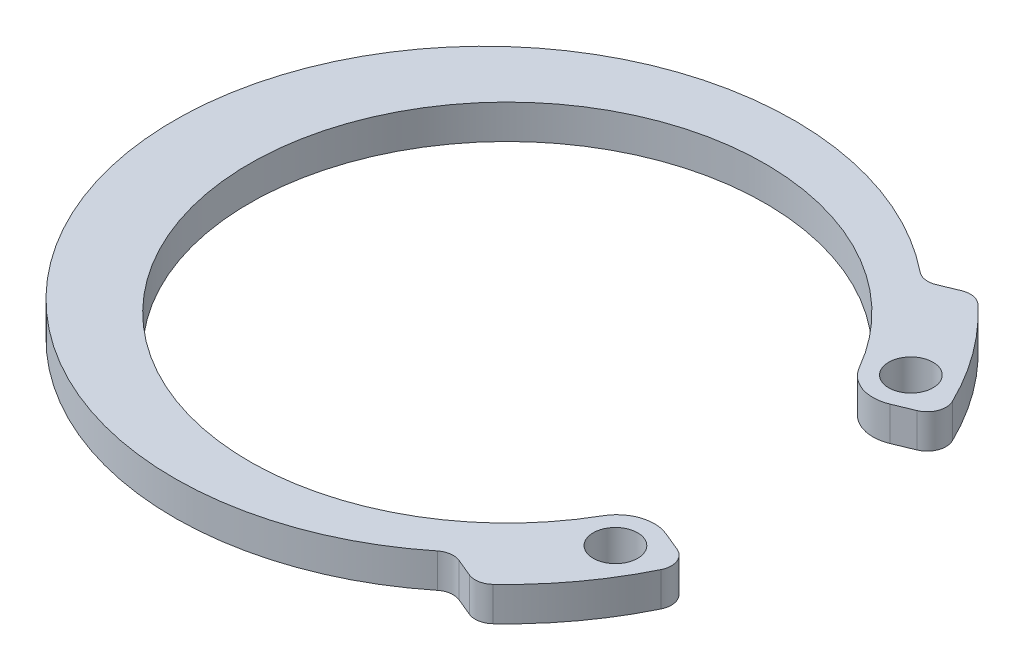
ISO-10303-21;
HEADER;
FILE_DESCRIPTION(('STEP AP214'),'2;1');
FILE_NAME('part.step','',(''),(''),'','','');
FILE_SCHEMA(('AUTOMOTIVE_DESIGN { 1 0 10303 214 1 1 1 1 }'));
ENDSEC;
DATA;
#1=APPLICATION_CONTEXT('core data for automotive mechanical design processes');
#2=APPLICATION_PROTOCOL_DEFINITION('international standard','automotive_design',2000,#1);
#3=PRODUCT_CONTEXT('',#1,'mechanical');
#4=PRODUCT('Part','Part','',(#3));
#5=PRODUCT_RELATED_PRODUCT_CATEGORY('part','',(#4));
#6=PRODUCT_DEFINITION_FORMATION('','',#4);
#7=PRODUCT_DEFINITION_CONTEXT('part definition',#1,'design');
#8=PRODUCT_DEFINITION('design','',#6,#7);
#9=PRODUCT_DEFINITION_SHAPE('','',#8);
#10=(LENGTH_UNIT() NAMED_UNIT(*) SI_UNIT(.MILLI.,.METRE.));
#11=(NAMED_UNIT(*) PLANE_ANGLE_UNIT() SI_UNIT($,.RADIAN.));
#12=(NAMED_UNIT(*) SI_UNIT($,.STERADIAN.) SOLID_ANGLE_UNIT());
#13=UNCERTAINTY_MEASURE_WITH_UNIT(LENGTH_MEASURE(1.E-05),#10,'distance_accuracy_value','');
#14=(GEOMETRIC_REPRESENTATION_CONTEXT(3) GLOBAL_UNCERTAINTY_ASSIGNED_CONTEXT((#13)) GLOBAL_UNIT_ASSIGNED_CONTEXT((#10,
#11,#12)) REPRESENTATION_CONTEXT('',''));
#15=CARTESIAN_POINT('',(0.,0.,0.));
#16=DIRECTION('',(0.,0.,1.));
#17=DIRECTION('',(1.,0.,0.));
#18=AXIS2_PLACEMENT_3D('',#15,#16,#17);
#19=CARTESIAN_POINT('',(6.30656928506754,0.5,6.69829708602438));
#20=DIRECTION('',(0.,1.,0.));
#21=DIRECTION('',(0.,0.,1.));
#22=AXIS2_PLACEMENT_3D('',#19,#20,#21);
#23=PLANE('',#22);
#24=CARTESIAN_POINT('',(7.49111974273539,0.5,4.32500000000001));
#25=DIRECTION('',(0.,1.,0.));
#26=DIRECTION('',(0.,0.,1.));
#27=AXIS2_PLACEMENT_3D('',#24,#25,#26);
#28=CIRCLE('',#27,0.649999999999999);
#29=CARTESIAN_POINT('',(7.49111974273539,0.5,4.97500000000001));
#30=VERTEX_POINT('',#29);
#31=EDGE_CURVE('E213',#30,#30,#28,.T.);
#32=ORIENTED_EDGE('',*,*,#31,.F.);
#33=EDGE_LOOP('',(#32));
#34=FACE_BOUND('',#33,.T.);
#35=CARTESIAN_POINT('',(6.30656928506754,0.5,6.69829708602438));
#36=DIRECTION('',(0.,1.,0.));
#37=DIRECTION('',(0.,0.,1.));
#38=AXIS2_PLACEMENT_3D('',#35,#36,#37);
#39=CIRCLE('',#38,0.550000000000001);
#40=CARTESIAN_POINT('',(6.09609339726674,0.5,7.20643082890558));
#41=VERTEX_POINT('',#40);
#42=CARTESIAN_POINT('',(6.68359244884876,0.5,7.0987387596454));
#43=VERTEX_POINT('',#42);
#44=EDGE_CURVE('E216',#41,#43,#39,.T.);
#45=ORIENTED_EDGE('',*,*,#44,.T.);
#46=CARTESIAN_POINT('',(0.,0.5,0.));
#47=DIRECTION('',(0.,1.,0.));
#48=DIRECTION('',(0.,0.,1.));
#49=AXIS2_PLACEMENT_3D('',#46,#47,#48);
#50=CIRCLE('',#49,9.75);
#51=CARTESIAN_POINT('',(8.76865554317916,0.5,4.26300128607457));
#52=VERTEX_POINT('',#51);
#53=EDGE_CURVE('E148',#43,#52,#50,.T.);
#54=ORIENTED_EDGE('',*,*,#53,.T.);
#55=CARTESIAN_POINT('',(8.2740134356152,0.5,4.02252429044985));
#56=DIRECTION('',(0.,1.,0.));
#57=DIRECTION('',(0.,0.,-1.));
#58=AXIS2_PLACEMENT_3D('',#55,#56,#57);
#59=CIRCLE('',#58,0.550000000000001);
#60=CARTESIAN_POINT('',(8.484489323416,0.5,3.51439054756864));
#61=VERTEX_POINT('',#60);
#62=EDGE_CURVE('E219',#52,#61,#59,.T.);
#63=ORIENTED_EDGE('',*,*,#62,.T.);
#64=DIRECTION('',(-0.923879532511286,0.,-0.382683432365091));
#65=VECTOR('',#64,1.);
#66=CARTESIAN_POINT('',(7.92667641354479,0.5,3.28333687503318));
#67=LINE('',#66,#65);
#68=CARTESIAN_POINT('',(7.92667641354479,0.5,3.28333687503318));
#69=VERTEX_POINT('',#68);
#70=EDGE_CURVE('E221',#61,#69,#67,.T.);
#71=ORIENTED_EDGE('',*,*,#70,.T.);
#72=CARTESIAN_POINT('',(7.50572463794319,0.5,4.2996043607956));
#73=DIRECTION('',(0.,1.,0.));
#74=DIRECTION('',(0.,0.,1.));
#75=AXIS2_PLACEMENT_3D('',#72,#73,#74);
#76=CIRCLE('',#75,1.1);
#77=CARTESIAN_POINT('',(6.55123942386949,0.5,3.75283386404703));
#78=VERTEX_POINT('',#77);
#79=EDGE_CURVE('E223',#69,#78,#76,.T.);
#80=ORIENTED_EDGE('',*,*,#79,.T.);
#81=CARTESIAN_POINT('',(0.,0.5,0.));
#82=DIRECTION('',(0.,-1.,0.));
#83=DIRECTION('',(0.,0.,1.));
#84=AXIS2_PLACEMENT_3D('',#81,#82,#83);
#85=CIRCLE('',#84,7.55);
#86=CARTESIAN_POINT('',(6.55123942386949,0.5,-3.75283386404703));
#87=VERTEX_POINT('',#86);
#88=EDGE_CURVE('E225',#78,#87,#85,.T.);
#89=ORIENTED_EDGE('',*,*,#88,.T.);
#90=CARTESIAN_POINT('',(7.50572463794319,0.5,-4.2996043607956));
#91=DIRECTION('',(0.,1.,0.));
#92=DIRECTION('',(0.,0.,-1.));
#93=AXIS2_PLACEMENT_3D('',#90,#91,#92);
#94=CIRCLE('',#93,1.1);
#95=CARTESIAN_POINT('',(7.92667641354479,0.5,-3.28333687503318));
#96=VERTEX_POINT('',#95);
#97=EDGE_CURVE('E227',#87,#96,#94,.T.);
#98=ORIENTED_EDGE('',*,*,#97,.T.);
#99=DIRECTION('',(0.923879532511287,0.,-0.38268343236509));
#100=VECTOR('',#99,1.);
#101=CARTESIAN_POINT('',(7.92667641354479,0.5,-3.28333687503318));
#102=LINE('',#101,#100);
#103=CARTESIAN_POINT('',(8.484489323416,0.5,-3.51439054756864));
#104=VERTEX_POINT('',#103);
#105=EDGE_CURVE('E229',#96,#104,#102,.T.);
#106=ORIENTED_EDGE('',*,*,#105,.T.);
#107=CARTESIAN_POINT('',(8.2740134356152,0.5,-4.02252429044985));
#108=DIRECTION('',(0.,1.,0.));
#109=DIRECTION('',(0.,0.,1.));
#110=AXIS2_PLACEMENT_3D('',#107,#108,#109);
#111=CIRCLE('',#110,0.550000000000001);
#112=CARTESIAN_POINT('',(8.76865554317916,0.5,-4.26300128607457));
#113=VERTEX_POINT('',#112);
#114=EDGE_CURVE('E231',#104,#113,#111,.T.);
#115=ORIENTED_EDGE('',*,*,#114,.T.);
#116=CARTESIAN_POINT('',(0.,0.5,0.));
#117=DIRECTION('',(0.,1.,0.));
#118=DIRECTION('',(0.,0.,-1.));
#119=AXIS2_PLACEMENT_3D('',#116,#117,#118);
#120=CIRCLE('',#119,9.75);
#121=CARTESIAN_POINT('',(6.68359244884875,0.5,-7.0987387596454));
#122=VERTEX_POINT('',#121);
#123=EDGE_CURVE('E233',#113,#122,#120,.T.);
#124=ORIENTED_EDGE('',*,*,#123,.T.);
#125=CARTESIAN_POINT('',(6.30656928506754,0.5,-6.69829708602438));
#126=DIRECTION('',(0.,1.,0.));
#127=DIRECTION('',(0.,0.,-1.));
#128=AXIS2_PLACEMENT_3D('',#125,#126,#127);
#129=CIRCLE('',#128,0.549999999999998);
#130=CARTESIAN_POINT('',(6.09609339726674,0.5,-7.20643082890559));
#131=VERTEX_POINT('',#130);
#132=EDGE_CURVE('E235',#122,#131,#129,.T.);
#133=ORIENTED_EDGE('',*,*,#132,.T.);
#134=DIRECTION('',(-0.923879532511286,0.,0.382683432365091));
#135=VECTOR('',#134,1.);
#136=CARTESIAN_POINT('',(5.57317503566976,0.5,-6.9898309515182));
#137=LINE('',#136,#135);
#138=CARTESIAN_POINT('',(5.57317503566976,0.5,-6.98983095151819));
#139=VERTEX_POINT('',#138);
#140=EDGE_CURVE('E237',#131,#139,#137,.T.);
#141=ORIENTED_EDGE('',*,*,#140,.T.);
#142=CARTESIAN_POINT('',(5.36269914786896,0.5,-7.4979646943994));
#143=DIRECTION('',(0.,-1.,0.));
#144=DIRECTION('',(0.,0.,1.));
#145=AXIS2_PLACEMENT_3D('',#142,#143,#144);
#146=CIRCLE('',#145,0.550000000000001);
#147=CARTESIAN_POINT('',(5.01778470905518,0.5,-7.06955597612003));
#148=VERTEX_POINT('',#147);
#149=EDGE_CURVE('E239',#139,#148,#146,.T.);
#150=ORIENTED_EDGE('',*,*,#149,.T.);
#151=CARTESIAN_POINT('',(-0.673957377705812,0.5,0.));
#152=DIRECTION('',(0.,1.,0.));
#153=DIRECTION('',(0.,0.,1.));
#154=AXIS2_PLACEMENT_3D('',#151,#152,#153);
#155=CIRCLE('',#154,9.07604262229419);
#156=CARTESIAN_POINT('',(5.01778470905518,0.5,7.06955597612003));
#157=VERTEX_POINT('',#156);
#158=EDGE_CURVE('E241',#148,#157,#155,.T.);
#159=ORIENTED_EDGE('',*,*,#158,.T.);
#160=CARTESIAN_POINT('',(5.36269914786896,0.5,7.4979646943994));
#161=DIRECTION('',(0.,-1.,0.));
#162=DIRECTION('',(0.,0.,-1.));
#163=AXIS2_PLACEMENT_3D('',#160,#161,#162);
#164=CIRCLE('',#163,0.55);
#165=CARTESIAN_POINT('',(5.57317503566976,0.5,6.98983095151819));
#166=VERTEX_POINT('',#165);
#167=EDGE_CURVE('E52',#157,#166,#164,.T.);
#168=ORIENTED_EDGE('',*,*,#167,.T.);
#169=DIRECTION('',(0.923879532511286,0.,0.382683432365091));
#170=VECTOR('',#169,1.);
#171=CARTESIAN_POINT('',(5.57317503566976,0.5,6.98983095151819));
#172=LINE('',#171,#170);
#173=EDGE_CURVE('E47',#166,#41,#172,.T.);
#174=ORIENTED_EDGE('',*,*,#173,.T.);
#175=EDGE_LOOP('',(#45,#54,#63,#71,#80,#89,#98,#106,#115,#124,#133,#141,#150,#159,#168,#174));
#176=FACE_BOUND('',#175,.T.);
#177=CARTESIAN_POINT('',(7.49111974273539,0.5,-4.32500000000001));
#178=DIRECTION('',(0.,1.,0.));
#179=DIRECTION('',(0.,0.,1.));
#180=AXIS2_PLACEMENT_3D('',#177,#178,#179);
#181=CIRCLE('',#180,0.649999999999999);
#182=CARTESIAN_POINT('',(7.49111974273539,0.5,-3.67500000000001));
#183=VERTEX_POINT('',#182);
#184=EDGE_CURVE('E210',#183,#183,#181,.T.);
#185=ORIENTED_EDGE('',*,*,#184,.F.);
#186=EDGE_LOOP('',(#185));
#187=FACE_BOUND('',#186,.T.);
#188=ADVANCED_FACE('F32',(#34,#176,#187),#23,.T.);
#189=CARTESIAN_POINT('',(6.30656928506754,0.5,6.69829708602438));
#190=DIRECTION('',(0.,-1.,0.));
#191=DIRECTION('',(0.,0.,-1.));
#192=AXIS2_PLACEMENT_3D('',#189,#190,#191);
#193=CYLINDRICAL_SURFACE('',#192,0.550000000000001);
#194=DIRECTION('',(0.,-1.,0.));
#195=VECTOR('',#194,1.);
#196=CARTESIAN_POINT('',(6.09609339726674,0.5,7.20643082890558));
#197=LINE('',#196,#195);
#198=CARTESIAN_POINT('',(6.09609339726674,-0.5,7.20643082890558));
#199=VERTEX_POINT('',#198);
#200=EDGE_CURVE('E163',#41,#199,#197,.T.);
#201=ORIENTED_EDGE('',*,*,#200,.T.);
#202=CARTESIAN_POINT('',(6.30656928506754,-0.5,6.69829708602438));
#203=DIRECTION('',(0.,1.,0.));
#204=DIRECTION('',(0.,0.,1.));
#205=AXIS2_PLACEMENT_3D('',#202,#203,#204);
#206=CIRCLE('',#205,0.550000000000001);
#207=CARTESIAN_POINT('',(6.68359244884876,-0.5,7.0987387596454));
#208=VERTEX_POINT('',#207);
#209=EDGE_CURVE('E157',#199,#208,#206,.T.);
#210=ORIENTED_EDGE('',*,*,#209,.T.);
#211=DIRECTION('',(0.,-1.,0.));
#212=VECTOR('',#211,1.);
#213=CARTESIAN_POINT('',(6.68359244884876,0.5,7.0987387596454));
#214=LINE('',#213,#212);
#215=EDGE_CURVE('E11',#43,#208,#214,.T.);
#216=ORIENTED_EDGE('',*,*,#215,.F.);
#217=ORIENTED_EDGE('',*,*,#44,.F.);
#218=EDGE_LOOP('',(#201,#210,#216,#217));
#219=FACE_BOUND('',#218,.T.);
#220=ADVANCED_FACE('F34',(#219),#193,.T.);
#221=CARTESIAN_POINT('',(0.,0.5,0.));
#222=DIRECTION('',(0.,-1.,0.));
#223=DIRECTION('',(0.,0.,-1.));
#224=AXIS2_PLACEMENT_3D('',#221,#222,#223);
#225=CYLINDRICAL_SURFACE('',#224,9.75);
#226=ORIENTED_EDGE('',*,*,#215,.T.);
#227=CARTESIAN_POINT('',(0.,-0.5,0.));
#228=DIRECTION('',(0.,1.,0.));
#229=DIRECTION('',(0.,0.,1.));
#230=AXIS2_PLACEMENT_3D('',#227,#228,#229);
#231=CIRCLE('',#230,9.75);
#232=CARTESIAN_POINT('',(8.76865554317916,-0.5,4.26300128607457));
#233=VERTEX_POINT('',#232);
#234=EDGE_CURVE('E147',#208,#233,#231,.T.);
#235=ORIENTED_EDGE('',*,*,#234,.T.);
#236=DIRECTION('',(0.,-1.,0.));
#237=VECTOR('',#236,1.);
#238=CARTESIAN_POINT('',(8.76865554317916,0.5,4.26300128607457));
#239=LINE('',#238,#237);
#240=EDGE_CURVE('E40',#52,#233,#239,.T.);
#241=ORIENTED_EDGE('',*,*,#240,.F.);
#242=ORIENTED_EDGE('',*,*,#53,.F.);
#243=EDGE_LOOP('',(#226,#235,#241,#242));
#244=FACE_BOUND('',#243,.T.);
#245=ADVANCED_FACE('F145',(#244),#225,.T.);
#246=CARTESIAN_POINT('',(8.2740134356152,0.5,4.02252429044985));
#247=DIRECTION('',(0.,-1.,0.));
#248=DIRECTION('',(0.,0.,-1.));
#249=AXIS2_PLACEMENT_3D('',#246,#247,#248);
#250=CYLINDRICAL_SURFACE('',#249,0.550000000000001);
#251=ORIENTED_EDGE('',*,*,#240,.T.);
#252=CARTESIAN_POINT('',(8.2740134356152,-0.5,4.02252429044985));
#253=DIRECTION('',(0.,1.,0.));
#254=DIRECTION('',(0.,0.,-1.));
#255=AXIS2_PLACEMENT_3D('',#252,#253,#254);
#256=CIRCLE('',#255,0.550000000000001);
#257=CARTESIAN_POINT('',(8.484489323416,-0.5,3.51439054756864));
#258=VERTEX_POINT('',#257);
#259=EDGE_CURVE('E161',#233,#258,#256,.T.);
#260=ORIENTED_EDGE('',*,*,#259,.T.);
#261=DIRECTION('',(0.,-1.,0.));
#262=VECTOR('',#261,1.);
#263=CARTESIAN_POINT('',(8.484489323416,0.5,3.51439054756864));
#264=LINE('',#263,#262);
#265=EDGE_CURVE('E270',#61,#258,#264,.T.);
#266=ORIENTED_EDGE('',*,*,#265,.F.);
#267=ORIENTED_EDGE('',*,*,#62,.F.);
#268=EDGE_LOOP('',(#251,#260,#266,#267));
#269=FACE_BOUND('',#268,.T.);
#270=ADVANCED_FACE('F273',(#269),#250,.T.);
#271=CARTESIAN_POINT('',(7.92667641354479,0.5,3.28333687503318));
#272=DIRECTION('',(-0.382683432365091,0.,0.923879532511286));
#273=DIRECTION('',(0.923879532511286,0.,0.382683432365091));
#274=AXIS2_PLACEMENT_3D('',#271,#272,#273);
#275=PLANE('',#274);
#276=ORIENTED_EDGE('',*,*,#265,.T.);
#277=DIRECTION('',(-0.923879532511286,0.,-0.382683432365091));
#278=VECTOR('',#277,1.);
#279=CARTESIAN_POINT('',(7.92667641354479,-0.5,3.28333687503318));
#280=LINE('',#279,#278);
#281=CARTESIAN_POINT('',(7.92667641354479,-0.5,3.28333687503318));
#282=VERTEX_POINT('',#281);
#283=EDGE_CURVE('E172',#258,#282,#280,.T.);
#284=ORIENTED_EDGE('',*,*,#283,.T.);
#285=DIRECTION('',(0.,-1.,0.));
#286=VECTOR('',#285,1.);
#287=CARTESIAN_POINT('',(7.92667641354479,0.5,3.28333687503318));
#288=LINE('',#287,#286);
#289=EDGE_CURVE('E268',#69,#282,#288,.T.);
#290=ORIENTED_EDGE('',*,*,#289,.F.);
#291=ORIENTED_EDGE('',*,*,#70,.F.);
#292=EDGE_LOOP('',(#276,#284,#290,#291));
#293=FACE_BOUND('',#292,.T.);
#294=ADVANCED_FACE('F281',(#293),#275,.F.);
#295=CARTESIAN_POINT('',(7.50572463794319,0.5,4.2996043607956));
#296=DIRECTION('',(0.,-1.,0.));
#297=DIRECTION('',(0.,0.,-1.));
#298=AXIS2_PLACEMENT_3D('',#295,#296,#297);
#299=CYLINDRICAL_SURFACE('',#298,1.1);
#300=ORIENTED_EDGE('',*,*,#289,.T.);
#301=CARTESIAN_POINT('',(7.50572463794319,-0.5,4.2996043607956));
#302=DIRECTION('',(0.,1.,0.));
#303=DIRECTION('',(0.,0.,1.));
#304=AXIS2_PLACEMENT_3D('',#301,#302,#303);
#305=CIRCLE('',#304,1.1);
#306=CARTESIAN_POINT('',(6.55123942386949,-0.5,3.75283386404703));
#307=VERTEX_POINT('',#306);
#308=EDGE_CURVE('E175',#282,#307,#305,.T.);
#309=ORIENTED_EDGE('',*,*,#308,.T.);
#310=DIRECTION('',(0.,-1.,0.));
#311=VECTOR('',#310,1.);
#312=CARTESIAN_POINT('',(6.55123942386949,0.5,3.75283386404703));
#313=LINE('',#312,#311);
#314=EDGE_CURVE('E266',#78,#307,#313,.T.);
#315=ORIENTED_EDGE('',*,*,#314,.F.);
#316=ORIENTED_EDGE('',*,*,#79,.F.);
#317=EDGE_LOOP('',(#300,#309,#315,#316));
#318=FACE_BOUND('',#317,.T.);
#319=ADVANCED_FACE('F284',(#318),#299,.T.);
#320=CARTESIAN_POINT('',(0.,0.5,0.));
#321=DIRECTION('',(0.,-1.,0.));
#322=DIRECTION('',(0.,0.,-1.));
#323=AXIS2_PLACEMENT_3D('',#320,#321,#322);
#324=CYLINDRICAL_SURFACE('',#323,7.55);
#325=ORIENTED_EDGE('',*,*,#314,.T.);
#326=CARTESIAN_POINT('',(0.,-0.5,0.));
#327=DIRECTION('',(0.,-1.,0.));
#328=DIRECTION('',(0.,0.,1.));
#329=AXIS2_PLACEMENT_3D('',#326,#327,#328);
#330=CIRCLE('',#329,7.55);
#331=CARTESIAN_POINT('',(6.55123942386949,-0.5,-3.75283386404703));
#332=VERTEX_POINT('',#331);
#333=EDGE_CURVE('E178',#307,#332,#330,.T.);
#334=ORIENTED_EDGE('',*,*,#333,.T.);
#335=DIRECTION('',(0.,-1.,0.));
#336=VECTOR('',#335,1.);
#337=CARTESIAN_POINT('',(6.55123942386949,0.5,-3.75283386404703));
#338=LINE('',#337,#336);
#339=EDGE_CURVE('E264',#87,#332,#338,.T.);
#340=ORIENTED_EDGE('',*,*,#339,.F.);
#341=ORIENTED_EDGE('',*,*,#88,.F.);
#342=EDGE_LOOP('',(#325,#334,#340,#341));
#343=FACE_BOUND('',#342,.T.);
#344=ADVANCED_FACE('F289',(#343),#324,.F.);
#345=CARTESIAN_POINT('',(7.50572463794319,0.5,-4.2996043607956));
#346=DIRECTION('',(0.,-1.,0.));
#347=DIRECTION('',(0.,0.,-1.));
#348=AXIS2_PLACEMENT_3D('',#345,#346,#347);
#349=CYLINDRICAL_SURFACE('',#348,1.1);
#350=ORIENTED_EDGE('',*,*,#339,.T.);
#351=CARTESIAN_POINT('',(7.50572463794319,-0.5,-4.2996043607956));
#352=DIRECTION('',(0.,1.,0.));
#353=DIRECTION('',(0.,0.,-1.));
#354=AXIS2_PLACEMENT_3D('',#351,#352,#353);
#355=CIRCLE('',#354,1.1);
#356=CARTESIAN_POINT('',(7.92667641354479,-0.5,-3.28333687503318));
#357=VERTEX_POINT('',#356);
#358=EDGE_CURVE('E181',#332,#357,#355,.T.);
#359=ORIENTED_EDGE('',*,*,#358,.T.);
#360=DIRECTION('',(0.,-1.,0.));
#361=VECTOR('',#360,1.);
#362=CARTESIAN_POINT('',(7.92667641354479,0.5,-3.28333687503318));
#363=LINE('',#362,#361);
#364=EDGE_CURVE('E262',#96,#357,#363,.T.);
#365=ORIENTED_EDGE('',*,*,#364,.F.);
#366=ORIENTED_EDGE('',*,*,#97,.F.);
#367=EDGE_LOOP('',(#350,#359,#365,#366));
#368=FACE_BOUND('',#367,.T.);
#369=ADVANCED_FACE('F295',(#368),#349,.T.);
#370=CARTESIAN_POINT('',(7.92667641354479,0.5,-3.28333687503318));
#371=DIRECTION('',(-0.38268343236509,0.,-0.923879532511287));
#372=DIRECTION('',(-0.923879532511287,0.,0.38268343236509));
#373=AXIS2_PLACEMENT_3D('',#370,#371,#372);
#374=PLANE('',#373);
#375=ORIENTED_EDGE('',*,*,#364,.T.);
#376=DIRECTION('',(0.923879532511287,0.,-0.38268343236509));
#377=VECTOR('',#376,1.);
#378=CARTESIAN_POINT('',(7.92667641354479,-0.5,-3.28333687503318));
#379=LINE('',#378,#377);
#380=CARTESIAN_POINT('',(8.484489323416,-0.5,-3.51439054756864));
#381=VERTEX_POINT('',#380);
#382=EDGE_CURVE('E184',#357,#381,#379,.T.);
#383=ORIENTED_EDGE('',*,*,#382,.T.);
#384=DIRECTION('',(0.,-1.,0.));
#385=VECTOR('',#384,1.);
#386=CARTESIAN_POINT('',(8.484489323416,0.5,-3.51439054756864));
#387=LINE('',#386,#385);
#388=EDGE_CURVE('E260',#104,#381,#387,.T.);
#389=ORIENTED_EDGE('',*,*,#388,.F.);
#390=ORIENTED_EDGE('',*,*,#105,.F.);
#391=EDGE_LOOP('',(#375,#383,#389,#390));
#392=FACE_BOUND('',#391,.T.);
#393=ADVANCED_FACE('F299',(#392),#374,.F.);
#394=CARTESIAN_POINT('',(8.2740134356152,0.5,-4.02252429044985));
#395=DIRECTION('',(0.,-1.,0.));
#396=DIRECTION('',(0.,0.,-1.));
#397=AXIS2_PLACEMENT_3D('',#394,#395,#396);
#398=CYLINDRICAL_SURFACE('',#397,0.550000000000001);
#399=ORIENTED_EDGE('',*,*,#388,.T.);
#400=CARTESIAN_POINT('',(8.2740134356152,-0.5,-4.02252429044985));
#401=DIRECTION('',(0.,1.,0.));
#402=DIRECTION('',(0.,0.,1.));
#403=AXIS2_PLACEMENT_3D('',#400,#401,#402);
#404=CIRCLE('',#403,0.550000000000001);
#405=CARTESIAN_POINT('',(8.76865554317916,-0.5,-4.26300128607457));
#406=VERTEX_POINT('',#405);
#407=EDGE_CURVE('E187',#381,#406,#404,.T.);
#408=ORIENTED_EDGE('',*,*,#407,.T.);
#409=DIRECTION('',(0.,-1.,0.));
#410=VECTOR('',#409,1.);
#411=CARTESIAN_POINT('',(8.76865554317916,0.5,-4.26300128607457));
#412=LINE('',#411,#410);
#413=EDGE_CURVE('E258',#113,#406,#412,.T.);
#414=ORIENTED_EDGE('',*,*,#413,.F.);
#415=ORIENTED_EDGE('',*,*,#114,.F.);
#416=EDGE_LOOP('',(#399,#408,#414,#415));
#417=FACE_BOUND('',#416,.T.);
#418=ADVANCED_FACE('F304',(#417),#398,.T.);
#419=CARTESIAN_POINT('',(0.,0.5,0.));
#420=DIRECTION('',(0.,-1.,0.));
#421=DIRECTION('',(0.,0.,-1.));
#422=AXIS2_PLACEMENT_3D('',#419,#420,#421);
#423=CYLINDRICAL_SURFACE('',#422,9.75);
#424=ORIENTED_EDGE('',*,*,#413,.T.);
#425=CARTESIAN_POINT('',(0.,-0.5,0.));
#426=DIRECTION('',(0.,1.,0.));
#427=DIRECTION('',(0.,0.,-1.));
#428=AXIS2_PLACEMENT_3D('',#425,#426,#427);
#429=CIRCLE('',#428,9.75);
#430=CARTESIAN_POINT('',(6.68359244884875,-0.5,-7.0987387596454));
#431=VERTEX_POINT('',#430);
#432=EDGE_CURVE('E190',#406,#431,#429,.T.);
#433=ORIENTED_EDGE('',*,*,#432,.T.);
#434=DIRECTION('',(0.,-1.,0.));
#435=VECTOR('',#434,1.);
#436=CARTESIAN_POINT('',(6.68359244884875,0.5,-7.0987387596454));
#437=LINE('',#436,#435);
#438=EDGE_CURVE('E256',#122,#431,#437,.T.);
#439=ORIENTED_EDGE('',*,*,#438,.F.);
#440=ORIENTED_EDGE('',*,*,#123,.F.);
#441=EDGE_LOOP('',(#424,#433,#439,#440));
#442=FACE_BOUND('',#441,.T.);
#443=ADVANCED_FACE('F310',(#442),#423,.T.);
#444=CARTESIAN_POINT('',(6.30656928506754,0.5,-6.69829708602438));
#445=DIRECTION('',(0.,-1.,0.));
#446=DIRECTION('',(0.,0.,-1.));
#447=AXIS2_PLACEMENT_3D('',#444,#445,#446);
#448=CYLINDRICAL_SURFACE('',#447,0.549999999999998);
#449=ORIENTED_EDGE('',*,*,#438,.T.);
#450=CARTESIAN_POINT('',(6.30656928506754,-0.5,-6.69829708602438));
#451=DIRECTION('',(0.,1.,0.));
#452=DIRECTION('',(0.,0.,-1.));
#453=AXIS2_PLACEMENT_3D('',#450,#451,#452);
#454=CIRCLE('',#453,0.549999999999998);
#455=CARTESIAN_POINT('',(6.09609339726674,-0.5,-7.20643082890559));
#456=VERTEX_POINT('',#455);
#457=EDGE_CURVE('E193',#431,#456,#454,.T.);
#458=ORIENTED_EDGE('',*,*,#457,.T.);
#459=DIRECTION('',(0.,-1.,0.));
#460=VECTOR('',#459,1.);
#461=CARTESIAN_POINT('',(6.09609339726674,0.5,-7.20643082890559));
#462=LINE('',#461,#460);
#463=EDGE_CURVE('E254',#131,#456,#462,.T.);
#464=ORIENTED_EDGE('',*,*,#463,.F.);
#465=ORIENTED_EDGE('',*,*,#132,.F.);
#466=EDGE_LOOP('',(#449,#458,#464,#465));
#467=FACE_BOUND('',#466,.T.);
#468=ADVANCED_FACE('F314',(#467),#448,.T.);
#469=CARTESIAN_POINT('',(5.57317503566976,0.5,-6.9898309515182));
#470=DIRECTION('',(0.382683432365091,0.,0.923879532511286));
#471=DIRECTION('',(0.923879532511286,0.,-0.382683432365091));
#472=AXIS2_PLACEMENT_3D('',#469,#470,#471);
#473=PLANE('',#472);
#474=ORIENTED_EDGE('',*,*,#463,.T.);
#475=DIRECTION('',(-0.923879532511286,0.,0.382683432365091));
#476=VECTOR('',#475,1.);
#477=CARTESIAN_POINT('',(5.57317503566976,-0.5,-6.9898309515182));
#478=LINE('',#477,#476);
#479=CARTESIAN_POINT('',(5.57317503566976,-0.5,-6.98983095151819));
#480=VERTEX_POINT('',#479);
#481=EDGE_CURVE('E196',#456,#480,#478,.T.);
#482=ORIENTED_EDGE('',*,*,#481,.T.);
#483=DIRECTION('',(0.,-1.,0.));
#484=VECTOR('',#483,1.);
#485=CARTESIAN_POINT('',(5.57317503566976,0.5,-6.98983095151819));
#486=LINE('',#485,#484);
#487=EDGE_CURVE('E252',#139,#480,#486,.T.);
#488=ORIENTED_EDGE('',*,*,#487,.F.);
#489=ORIENTED_EDGE('',*,*,#140,.F.);
#490=EDGE_LOOP('',(#474,#482,#488,#489));
#491=FACE_BOUND('',#490,.T.);
#492=ADVANCED_FACE('F319',(#491),#473,.F.);
#493=CARTESIAN_POINT('',(5.36269914786896,0.5,-7.4979646943994));
#494=DIRECTION('',(0.,-1.,0.));
#495=DIRECTION('',(0.,0.,-1.));
#496=AXIS2_PLACEMENT_3D('',#493,#494,#495);
#497=CYLINDRICAL_SURFACE('',#496,0.550000000000001);
#498=ORIENTED_EDGE('',*,*,#487,.T.);
#499=CARTESIAN_POINT('',(5.36269914786896,-0.5,-7.4979646943994));
#500=DIRECTION('',(0.,-1.,0.));
#501=DIRECTION('',(0.,0.,1.));
#502=AXIS2_PLACEMENT_3D('',#499,#500,#501);
#503=CIRCLE('',#502,0.550000000000001);
#504=CARTESIAN_POINT('',(5.01778470905518,-0.5,-7.06955597612003));
#505=VERTEX_POINT('',#504);
#506=EDGE_CURVE('E199',#480,#505,#503,.T.);
#507=ORIENTED_EDGE('',*,*,#506,.T.);
#508=DIRECTION('',(0.,-1.,0.));
#509=VECTOR('',#508,1.);
#510=CARTESIAN_POINT('',(5.01778470905518,0.5,-7.06955597612003));
#511=LINE('',#510,#509);
#512=EDGE_CURVE('E250',#148,#505,#511,.T.);
#513=ORIENTED_EDGE('',*,*,#512,.F.);
#514=ORIENTED_EDGE('',*,*,#149,.F.);
#515=EDGE_LOOP('',(#498,#507,#513,#514));
#516=FACE_BOUND('',#515,.T.);
#517=ADVANCED_FACE('F325',(#516),#497,.F.);
#518=CARTESIAN_POINT('',(-0.673957377705812,0.5,0.));
#519=DIRECTION('',(0.,-1.,0.));
#520=DIRECTION('',(0.,0.,-1.));
#521=AXIS2_PLACEMENT_3D('',#518,#519,#520);
#522=CYLINDRICAL_SURFACE('',#521,9.07604262229419);
#523=ORIENTED_EDGE('',*,*,#512,.T.);
#524=CARTESIAN_POINT('',(-0.673957377705812,-0.5,0.));
#525=DIRECTION('',(0.,1.,0.));
#526=DIRECTION('',(0.,0.,1.));
#527=AXIS2_PLACEMENT_3D('',#524,#525,#526);
#528=CIRCLE('',#527,9.07604262229419);
#529=CARTESIAN_POINT('',(5.01778470905518,-0.5,7.06955597612003));
#530=VERTEX_POINT('',#529);
#531=EDGE_CURVE('E202',#505,#530,#528,.T.);
#532=ORIENTED_EDGE('',*,*,#531,.T.);
#533=DIRECTION('',(0.,-1.,0.));
#534=VECTOR('',#533,1.);
#535=CARTESIAN_POINT('',(5.01778470905518,0.5,7.06955597612003));
#536=LINE('',#535,#534);
#537=EDGE_CURVE('E248',#157,#530,#536,.T.);
#538=ORIENTED_EDGE('',*,*,#537,.F.);
#539=ORIENTED_EDGE('',*,*,#158,.F.);
#540=EDGE_LOOP('',(#523,#532,#538,#539));
#541=FACE_BOUND('',#540,.T.);
#542=ADVANCED_FACE('F329',(#541),#522,.T.);
#543=CARTESIAN_POINT('',(5.36269914786896,0.5,7.4979646943994));
#544=DIRECTION('',(0.,-1.,0.));
#545=DIRECTION('',(0.,0.,-1.));
#546=AXIS2_PLACEMENT_3D('',#543,#544,#545);
#547=CYLINDRICAL_SURFACE('',#546,0.55);
#548=ORIENTED_EDGE('',*,*,#537,.T.);
#549=CARTESIAN_POINT('',(5.36269914786896,-0.5,7.4979646943994));
#550=DIRECTION('',(0.,-1.,0.));
#551=DIRECTION('',(0.,0.,-1.));
#552=AXIS2_PLACEMENT_3D('',#549,#550,#551);
#553=CIRCLE('',#552,0.55);
#554=CARTESIAN_POINT('',(5.57317503566976,-0.5,6.98983095151819));
#555=VERTEX_POINT('',#554);
#556=EDGE_CURVE('E205',#530,#555,#553,.T.);
#557=ORIENTED_EDGE('',*,*,#556,.T.);
#558=DIRECTION('',(0.,-1.,0.));
#559=VECTOR('',#558,1.);
#560=CARTESIAN_POINT('',(5.57317503566976,0.5,6.98983095151819));
#561=LINE('',#560,#559);
#562=EDGE_CURVE('E246',#166,#555,#561,.T.);
#563=ORIENTED_EDGE('',*,*,#562,.F.);
#564=ORIENTED_EDGE('',*,*,#167,.F.);
#565=EDGE_LOOP('',(#548,#557,#563,#564));
#566=FACE_BOUND('',#565,.T.);
#567=ADVANCED_FACE('F332',(#566),#547,.F.);
#568=CARTESIAN_POINT('',(5.57317503566976,0.5,6.98983095151819));
#569=DIRECTION('',(0.382683432365091,0.,-0.923879532511286));
#570=DIRECTION('',(-0.923879532511286,0.,-0.382683432365091));
#571=AXIS2_PLACEMENT_3D('',#568,#569,#570);
#572=PLANE('',#571);
#573=ORIENTED_EDGE('',*,*,#562,.T.);
#574=DIRECTION('',(0.923879532511286,0.,0.382683432365091));
#575=VECTOR('',#574,1.);
#576=CARTESIAN_POINT('',(5.57317503566976,-0.5,6.98983095151819));
#577=LINE('',#576,#575);
#578=EDGE_CURVE('E208',#555,#199,#577,.T.);
#579=ORIENTED_EDGE('',*,*,#578,.T.);
#580=ORIENTED_EDGE('',*,*,#200,.F.);
#581=ORIENTED_EDGE('',*,*,#173,.F.);
#582=EDGE_LOOP('',(#573,#579,#580,#581));
#583=FACE_BOUND('',#582,.T.);
#584=ADVANCED_FACE('F334',(#583),#572,.F.);
#585=CARTESIAN_POINT('',(7.49111974273539,0.5,4.32500000000001));
#586=DIRECTION('',(0.,-1.,0.));
#587=DIRECTION('',(0.,0.,-1.));
#588=AXIS2_PLACEMENT_3D('',#585,#586,#587);
#589=CYLINDRICAL_SURFACE('',#588,0.649999999999999);
#590=ORIENTED_EDGE('',*,*,#31,.T.);
#591=EDGE_LOOP('',(#590));
#592=FACE_BOUND('',#591,.T.);
#593=CARTESIAN_POINT('',(7.49111974273539,-0.5,4.32500000000001));
#594=DIRECTION('',(0.,1.,0.));
#595=DIRECTION('',(0.,0.,1.));
#596=AXIS2_PLACEMENT_3D('',#593,#594,#595);
#597=CIRCLE('',#596,0.649999999999999);
#598=CARTESIAN_POINT('',(7.49111974273539,-0.5,4.97500000000001));
#599=VERTEX_POINT('',#598);
#600=EDGE_CURVE('E164',#599,#599,#597,.T.);
#601=ORIENTED_EDGE('',*,*,#600,.F.);
#602=EDGE_LOOP('',(#601));
#603=FACE_BOUND('',#602,.T.);
#604=ADVANCED_FACE('F336',(#592,#603),#589,.F.);
#605=CARTESIAN_POINT('',(7.49111974273539,0.5,-4.32500000000001));
#606=DIRECTION('',(0.,-1.,0.));
#607=DIRECTION('',(0.,0.,-1.));
#608=AXIS2_PLACEMENT_3D('',#605,#606,#607);
#609=CYLINDRICAL_SURFACE('',#608,0.649999999999999);
#610=ORIENTED_EDGE('',*,*,#184,.T.);
#611=EDGE_LOOP('',(#610));
#612=FACE_BOUND('',#611,.T.);
#613=CARTESIAN_POINT('',(7.49111974273539,-0.5,-4.32500000000001));
#614=DIRECTION('',(0.,1.,0.));
#615=DIRECTION('',(0.,0.,1.));
#616=AXIS2_PLACEMENT_3D('',#613,#614,#615);
#617=CIRCLE('',#616,0.649999999999999);
#618=CARTESIAN_POINT('',(7.49111974273539,-0.5,-3.67500000000001));
#619=VERTEX_POINT('',#618);
#620=EDGE_CURVE('E167',#619,#619,#617,.T.);
#621=ORIENTED_EDGE('',*,*,#620,.F.);
#622=EDGE_LOOP('',(#621));
#623=FACE_BOUND('',#622,.T.);
#624=ADVANCED_FACE('F342',(#612,#623),#609,.F.);
#625=CARTESIAN_POINT('',(6.30656928506754,-0.5,6.69829708602438));
#626=DIRECTION('',(0.,1.,0.));
#627=DIRECTION('',(0.,0.,1.));
#628=AXIS2_PLACEMENT_3D('',#625,#626,#627);
#629=PLANE('',#628);
#630=ORIENTED_EDGE('',*,*,#620,.T.);
#631=EDGE_LOOP('',(#630));
#632=FACE_BOUND('',#631,.T.);
#633=ORIENTED_EDGE('',*,*,#600,.T.);
#634=EDGE_LOOP('',(#633));
#635=FACE_BOUND('',#634,.T.);
#636=ORIENTED_EDGE('',*,*,#209,.F.);
#637=ORIENTED_EDGE('',*,*,#578,.F.);
#638=ORIENTED_EDGE('',*,*,#556,.F.);
#639=ORIENTED_EDGE('',*,*,#531,.F.);
#640=ORIENTED_EDGE('',*,*,#506,.F.);
#641=ORIENTED_EDGE('',*,*,#481,.F.);
#642=ORIENTED_EDGE('',*,*,#457,.F.);
#643=ORIENTED_EDGE('',*,*,#432,.F.);
#644=ORIENTED_EDGE('',*,*,#407,.F.);
#645=ORIENTED_EDGE('',*,*,#382,.F.);
#646=ORIENTED_EDGE('',*,*,#358,.F.);
#647=ORIENTED_EDGE('',*,*,#333,.F.);
#648=ORIENTED_EDGE('',*,*,#308,.F.);
#649=ORIENTED_EDGE('',*,*,#283,.F.);
#650=ORIENTED_EDGE('',*,*,#259,.F.);
#651=ORIENTED_EDGE('',*,*,#234,.F.);
#652=EDGE_LOOP('',(#636,#637,#638,#639,#640,#641,#642,#643,#644,#645,#646,#647,#648,#649,#650,#651));
#653=FACE_BOUND('',#652,.T.);
#654=ADVANCED_FACE('F155',(#632,#635,#653),#629,.F.);
#655=CLOSED_SHELL('',(#188,#220,#245,#270,#294,#319,#344,#369,#393,#418,#443,#468,#492,#517,
#542,#567,#584,#604,#624,#654));
#656=MANIFOLD_SOLID_BREP('B2',#655);
#657=ADVANCED_BREP_SHAPE_REPRESENTATION('',(#18,#656),#14);
#658=SHAPE_DEFINITION_REPRESENTATION(#9,#657);
ENDSEC;
END-ISO-10303-21;
